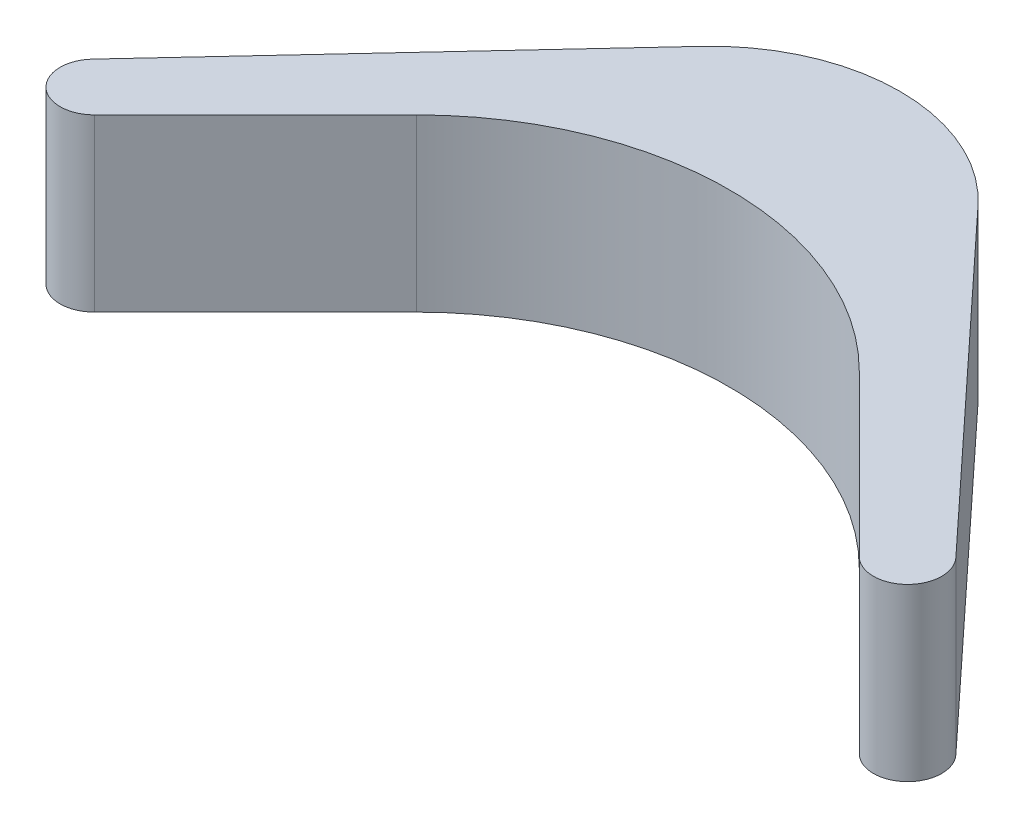
ISO-10303-21;
HEADER;
FILE_DESCRIPTION(('STEP AP214'),'2;1');
FILE_NAME('part.step','',(''),(''),'','','');
FILE_SCHEMA(('AUTOMOTIVE_DESIGN { 1 0 10303 214 1 1 1 1 }'));
ENDSEC;
DATA;
#1=APPLICATION_CONTEXT('core data for automotive mechanical design processes');
#2=APPLICATION_PROTOCOL_DEFINITION('international standard','automotive_design',2000,#1);
#3=PRODUCT_CONTEXT('',#1,'mechanical');
#4=PRODUCT('Part','Part','',(#3));
#5=PRODUCT_RELATED_PRODUCT_CATEGORY('part','',(#4));
#6=PRODUCT_DEFINITION_FORMATION('','',#4);
#7=PRODUCT_DEFINITION_CONTEXT('part definition',#1,'design');
#8=PRODUCT_DEFINITION('design','',#6,#7);
#9=PRODUCT_DEFINITION_SHAPE('','',#8);
#10=(LENGTH_UNIT() NAMED_UNIT(*) SI_UNIT(.MILLI.,.METRE.));
#11=(NAMED_UNIT(*) PLANE_ANGLE_UNIT() SI_UNIT($,.RADIAN.));
#12=(NAMED_UNIT(*) SI_UNIT($,.STERADIAN.) SOLID_ANGLE_UNIT());
#13=UNCERTAINTY_MEASURE_WITH_UNIT(LENGTH_MEASURE(1.E-05),#10,'distance_accuracy_value','');
#14=(GEOMETRIC_REPRESENTATION_CONTEXT(3) GLOBAL_UNCERTAINTY_ASSIGNED_CONTEXT((#13)) GLOBAL_UNIT_ASSIGNED_CONTEXT((#10,
#11,#12)) REPRESENTATION_CONTEXT('',''));
#15=CARTESIAN_POINT('',(0.,0.,0.));
#16=DIRECTION('',(0.,0.,1.));
#17=DIRECTION('',(1.,0.,0.));
#18=AXIS2_PLACEMENT_3D('',#15,#16,#17);
#19=CARTESIAN_POINT('',(25.0496242970424,15.,-23.2931720856756));
#20=DIRECTION('',(0.732315080008866,0.,-0.68096594892227));
#21=DIRECTION('',(-0.68096594892227,0.,-0.732315080008866));
#22=AXIS2_PLACEMENT_3D('',#19,#20,#21);
#23=PLANE('',#22);
#24=DIRECTION('',(0.68096594892227,0.,0.732315080008866));
#25=VECTOR('',#24,1.);
#26=CARTESIAN_POINT('',(25.0496242970424,0.,-23.2931720856756));
#27=LINE('',#26,#25);
#28=CARTESIAN_POINT('',(12.1319215547242,0.,-37.1849511566307));
#29=VERTEX_POINT('',#28);
#30=CARTESIAN_POINT('',(37.9058376899472,0.,-9.46751904922576));
#31=VERTEX_POINT('',#30);
#32=EDGE_CURVE('E129',#29,#31,#27,.T.);
#33=ORIENTED_EDGE('',*,*,#32,.F.);
#34=DIRECTION('',(0.,-1.,0.));
#35=VECTOR('',#34,1.);
#36=CARTESIAN_POINT('',(12.1319215547242,15.,-37.1849511566307));
#37=LINE('',#36,#35);
#38=CARTESIAN_POINT('',(12.1319215547242,15.,-37.1849511566307));
#39=VERTEX_POINT('',#38);
#40=EDGE_CURVE('E11',#39,#29,#37,.T.);
#41=ORIENTED_EDGE('',*,*,#40,.F.);
#42=DIRECTION('',(0.68096594892227,0.,0.732315080008866));
#43=VECTOR('',#42,1.);
#44=CARTESIAN_POINT('',(25.0496242970424,15.,-23.2931720856756));
#45=LINE('',#44,#43);
#46=CARTESIAN_POINT('',(37.9058376899472,15.,-9.46751904922576));
#47=VERTEX_POINT('',#46);
#48=EDGE_CURVE('E148',#39,#47,#45,.T.);
#49=ORIENTED_EDGE('',*,*,#48,.T.);
#50=DIRECTION('',(0.,-1.,0.));
#51=VECTOR('',#50,1.);
#52=CARTESIAN_POINT('',(37.9058376899472,15.,-9.46751904922576));
#53=LINE('',#52,#51);
#54=EDGE_CURVE('E85',#47,#31,#53,.T.);
#55=ORIENTED_EDGE('',*,*,#54,.T.);
#56=EDGE_LOOP('',(#33,#41,#49,#55));
#57=FACE_BOUND('',#56,.T.);
#58=ADVANCED_FACE('F35',(#57),#23,.T.);
#59=CARTESIAN_POINT('',(0.,15.,-25.9037066496034));
#60=DIRECTION('',(0.,-1.,0.));
#61=DIRECTION('',(0.,0.,-1.));
#62=AXIS2_PLACEMENT_3D('',#59,#60,#61);
#63=CYLINDRICAL_SURFACE('',#62,16.5665324747612);
#64=CARTESIAN_POINT('',(0.,0.,-25.9037066496034));
#65=DIRECTION('',(0.,1.,0.));
#66=DIRECTION('',(0.,0.,1.));
#67=AXIS2_PLACEMENT_3D('',#64,#65,#66);
#68=CIRCLE('',#67,16.5665324747612);
#69=CARTESIAN_POINT('',(-12.1319215547243,0.,-37.1849511566307));
#70=VERTEX_POINT('',#69);
#71=EDGE_CURVE('E132',#29,#70,#68,.T.);
#72=ORIENTED_EDGE('',*,*,#71,.T.);
#73=DIRECTION('',(0.,-1.,0.));
#74=VECTOR('',#73,1.);
#75=CARTESIAN_POINT('',(-12.1319215547243,15.,-37.1849511566307));
#76=LINE('',#75,#74);
#77=CARTESIAN_POINT('',(-12.1319215547243,15.,-37.1849511566307));
#78=VERTEX_POINT('',#77);
#79=EDGE_CURVE('E43',#78,#70,#76,.T.);
#80=ORIENTED_EDGE('',*,*,#79,.F.);
#81=CARTESIAN_POINT('',(0.,15.,-25.9037066496034));
#82=DIRECTION('',(0.,1.,0.));
#83=DIRECTION('',(0.,0.,1.));
#84=AXIS2_PLACEMENT_3D('',#81,#82,#83);
#85=CIRCLE('',#84,16.5665324747612);
#86=EDGE_CURVE('E173',#39,#78,#85,.T.);
#87=ORIENTED_EDGE('',*,*,#86,.F.);
#88=ORIENTED_EDGE('',*,*,#40,.T.);
#89=EDGE_LOOP('',(#72,#80,#87,#88));
#90=FACE_BOUND('',#89,.T.);
#91=ADVANCED_FACE('F164',(#90),#63,.T.);
#92=CARTESIAN_POINT('',(-25.0496242970424,15.,-23.2931720856756));
#93=DIRECTION('',(-0.732315080008867,0.,-0.680965948922269));
#94=DIRECTION('',(-0.680965948922269,0.,0.732315080008867));
#95=AXIS2_PLACEMENT_3D('',#92,#93,#94);
#96=PLANE('',#95);
#97=DIRECTION('',(0.680965948922269,0.,-0.732315080008867));
#98=VECTOR('',#97,1.);
#99=CARTESIAN_POINT('',(-25.0496242970424,0.,-23.2931720856756));
#100=LINE('',#99,#98);
#101=CARTESIAN_POINT('',(-37.9058376899465,0.,-9.46751904922648));
#102=VERTEX_POINT('',#101);
#103=EDGE_CURVE('E135',#102,#70,#100,.T.);
#104=ORIENTED_EDGE('',*,*,#103,.F.);
#105=DIRECTION('',(0.,-1.,0.));
#106=VECTOR('',#105,1.);
#107=CARTESIAN_POINT('',(-37.9058376899465,15.,-9.46751904922648));
#108=LINE('',#107,#106);
#109=CARTESIAN_POINT('',(-37.9058376899465,15.,-9.46751904922648));
#110=VERTEX_POINT('',#109);
#111=EDGE_CURVE('E154',#110,#102,#108,.T.);
#112=ORIENTED_EDGE('',*,*,#111,.F.);
#113=DIRECTION('',(0.680965948922269,0.,-0.732315080008867));
#114=VECTOR('',#113,1.);
#115=CARTESIAN_POINT('',(-25.0496242970424,15.,-23.2931720856756));
#116=LINE('',#115,#114);
#117=EDGE_CURVE('E161',#110,#78,#116,.T.);
#118=ORIENTED_EDGE('',*,*,#117,.T.);
#119=ORIENTED_EDGE('',*,*,#79,.T.);
#120=EDGE_LOOP('',(#104,#112,#118,#119));
#121=FACE_BOUND('',#120,.T.);
#122=ADVANCED_FACE('F159',(#121),#96,.T.);
#123=CARTESIAN_POINT('',(-35.7088924499199,15.,-7.42462120245968));
#124=DIRECTION('',(0.,-1.,0.));
#125=DIRECTION('',(0.,0.,-1.));
#126=AXIS2_PLACEMENT_3D('',#123,#124,#125);
#127=CYLINDRICAL_SURFACE('',#126,3.);
#128=CARTESIAN_POINT('',(-35.7088924499199,0.,-7.42462120245968));
#129=DIRECTION('',(0.,1.,0.));
#130=DIRECTION('',(0.,0.,1.));
#131=AXIS2_PLACEMENT_3D('',#128,#129,#130);
#132=CIRCLE('',#131,3.);
#133=CARTESIAN_POINT('',(-33.5875721063602,0.,-5.30330085890003));
#134=VERTEX_POINT('',#133);
#135=EDGE_CURVE('E138',#102,#134,#132,.T.);
#136=ORIENTED_EDGE('',*,*,#135,.T.);
#137=DIRECTION('',(0.,-1.,0.));
#138=VECTOR('',#137,1.);
#139=CARTESIAN_POINT('',(-33.5875721063602,15.,-5.30330085890003));
#140=LINE('',#139,#138);
#141=CARTESIAN_POINT('',(-33.5875721063602,15.,-5.30330085890003));
#142=VERTEX_POINT('',#141);
#143=EDGE_CURVE('E152',#142,#134,#140,.T.);
#144=ORIENTED_EDGE('',*,*,#143,.F.);
#145=CARTESIAN_POINT('',(-35.7088924499199,15.,-7.42462120245968));
#146=DIRECTION('',(0.,1.,0.));
#147=DIRECTION('',(0.,0.,1.));
#148=AXIS2_PLACEMENT_3D('',#145,#146,#147);
#149=CIRCLE('',#148,3.);
#150=EDGE_CURVE('E124',#110,#142,#149,.T.);
#151=ORIENTED_EDGE('',*,*,#150,.F.);
#152=ORIENTED_EDGE('',*,*,#111,.T.);
#153=EDGE_LOOP('',(#136,#144,#151,#152));
#154=FACE_BOUND('',#153,.T.);
#155=ADVANCED_FACE('F171',(#154),#127,.T.);
#156=CARTESIAN_POINT('',(-19.4454364826299,15.,-19.4454364826302));
#157=DIRECTION('',(0.707106781186544,0.,0.707106781186552));
#158=DIRECTION('',(0.707106781186552,0.,-0.707106781186544));
#159=AXIS2_PLACEMENT_3D('',#156,#157,#158);
#160=PLANE('',#159);
#161=DIRECTION('',(-0.707106781186552,0.,0.707106781186544));
#162=VECTOR('',#161,1.);
#163=CARTESIAN_POINT('',(-19.4454364826299,0.,-19.4454364826302));
#164=LINE('',#163,#162);
#165=CARTESIAN_POINT('',(-19.4454364826292,0.,-19.4454364826309));
#166=VERTEX_POINT('',#165);
#167=EDGE_CURVE('E141',#166,#134,#164,.T.);
#168=ORIENTED_EDGE('',*,*,#167,.F.);
#169=DIRECTION('',(0.,-1.,0.));
#170=VECTOR('',#169,1.);
#171=CARTESIAN_POINT('',(-19.4454364826292,15.,-19.4454364826309));
#172=LINE('',#171,#170);
#173=CARTESIAN_POINT('',(-19.4454364826292,15.,-19.4454364826309));
#174=VERTEX_POINT('',#173);
#175=EDGE_CURVE('E113',#174,#166,#172,.T.);
#176=ORIENTED_EDGE('',*,*,#175,.F.);
#177=DIRECTION('',(-0.707106781186552,0.,0.707106781186544));
#178=VECTOR('',#177,1.);
#179=CARTESIAN_POINT('',(-19.4454364826299,15.,-19.4454364826302));
#180=LINE('',#179,#178);
#181=EDGE_CURVE('E122',#174,#142,#180,.T.);
#182=ORIENTED_EDGE('',*,*,#181,.T.);
#183=ORIENTED_EDGE('',*,*,#143,.T.);
#184=EDGE_LOOP('',(#168,#176,#182,#183));
#185=FACE_BOUND('',#184,.T.);
#186=ADVANCED_FACE('F188',(#185),#160,.T.);
#187=CARTESIAN_POINT('',(0.,15.,0.));
#188=DIRECTION('',(0.,-1.,0.));
#189=DIRECTION('',(0.,0.,-1.));
#190=AXIS2_PLACEMENT_3D('',#187,#188,#189);
#191=CYLINDRICAL_SURFACE('',#190,27.5);
#192=CARTESIAN_POINT('',(0.,0.,0.));
#193=DIRECTION('',(0.,1.,0.));
#194=DIRECTION('',(0.,0.,1.));
#195=AXIS2_PLACEMENT_3D('',#192,#193,#194);
#196=CIRCLE('',#195,27.5);
#197=CARTESIAN_POINT('',(19.44543648263,0.,-19.4454364826302));
#198=VERTEX_POINT('',#197);
#199=EDGE_CURVE('E112',#198,#166,#196,.T.);
#200=ORIENTED_EDGE('',*,*,#199,.F.);
#201=DIRECTION('',(0.,-1.,0.));
#202=VECTOR('',#201,1.);
#203=CARTESIAN_POINT('',(19.44543648263,15.,-19.4454364826302));
#204=LINE('',#203,#202);
#205=CARTESIAN_POINT('',(19.44543648263,15.,-19.4454364826302));
#206=VERTEX_POINT('',#205);
#207=EDGE_CURVE('E106',#206,#198,#204,.T.);
#208=ORIENTED_EDGE('',*,*,#207,.F.);
#209=CARTESIAN_POINT('',(0.,15.,0.));
#210=DIRECTION('',(0.,1.,0.));
#211=DIRECTION('',(0.,0.,1.));
#212=AXIS2_PLACEMENT_3D('',#209,#210,#211);
#213=CIRCLE('',#212,27.5);
#214=EDGE_CURVE('E110',#206,#174,#213,.T.);
#215=ORIENTED_EDGE('',*,*,#214,.T.);
#216=ORIENTED_EDGE('',*,*,#175,.T.);
#217=EDGE_LOOP('',(#200,#208,#215,#216));
#218=FACE_BOUND('',#217,.T.);
#219=ADVANCED_FACE('F108',(#218),#191,.F.);
#220=CARTESIAN_POINT('',(19.44543648263,15.,-19.4454364826302));
#221=DIRECTION('',(0.707106781186544,0.,-0.707106781186551));
#222=DIRECTION('',(-0.707106781186551,0.,-0.707106781186544));
#223=AXIS2_PLACEMENT_3D('',#220,#221,#222);
#224=PLANE('',#223);
#225=DIRECTION('',(0.707106781186551,0.,0.707106781186544));
#226=VECTOR('',#225,1.);
#227=CARTESIAN_POINT('',(19.44543648263,0.,-19.4454364826302));
#228=LINE('',#227,#226);
#229=CARTESIAN_POINT('',(33.587572106361,0.,-5.30330085889928));
#230=VERTEX_POINT('',#229);
#231=EDGE_CURVE('E78',#198,#230,#228,.T.);
#232=ORIENTED_EDGE('',*,*,#231,.T.);
#233=DIRECTION('',(0.,-1.,0.));
#234=VECTOR('',#233,1.);
#235=CARTESIAN_POINT('',(33.587572106361,15.,-5.30330085889928));
#236=LINE('',#235,#234);
#237=CARTESIAN_POINT('',(33.587572106361,15.,-5.30330085889928));
#238=VERTEX_POINT('',#237);
#239=EDGE_CURVE('E114',#238,#230,#236,.T.);
#240=ORIENTED_EDGE('',*,*,#239,.F.);
#241=DIRECTION('',(0.707106781186551,0.,0.707106781186544));
#242=VECTOR('',#241,1.);
#243=CARTESIAN_POINT('',(19.44543648263,15.,-19.4454364826302));
#244=LINE('',#243,#242);
#245=EDGE_CURVE('E116',#206,#238,#244,.T.);
#246=ORIENTED_EDGE('',*,*,#245,.F.);
#247=ORIENTED_EDGE('',*,*,#207,.T.);
#248=EDGE_LOOP('',(#232,#240,#246,#247));
#249=FACE_BOUND('',#248,.T.);
#250=ADVANCED_FACE('F117',(#249),#224,.F.);
#251=CARTESIAN_POINT('',(35.7088924499206,15.,-7.42462120245894));
#252=DIRECTION('',(0.,-1.,0.));
#253=DIRECTION('',(0.,0.,-1.));
#254=AXIS2_PLACEMENT_3D('',#251,#252,#253);
#255=CYLINDRICAL_SURFACE('',#254,3.00000000000001);
#256=CARTESIAN_POINT('',(35.7088924499206,0.,-7.42462120245894));
#257=DIRECTION('',(0.,1.,0.));
#258=DIRECTION('',(0.,0.,1.));
#259=AXIS2_PLACEMENT_3D('',#256,#257,#258);
#260=CIRCLE('',#259,3.00000000000001);
#261=EDGE_CURVE('E146',#230,#31,#260,.T.);
#262=ORIENTED_EDGE('',*,*,#261,.T.);
#263=ORIENTED_EDGE('',*,*,#54,.F.);
#264=CARTESIAN_POINT('',(35.7088924499206,15.,-7.42462120245894));
#265=DIRECTION('',(0.,1.,0.));
#266=DIRECTION('',(0.,0.,1.));
#267=AXIS2_PLACEMENT_3D('',#264,#265,#266);
#268=CIRCLE('',#267,3.00000000000001);
#269=EDGE_CURVE('E51',#238,#47,#268,.T.);
#270=ORIENTED_EDGE('',*,*,#269,.F.);
#271=ORIENTED_EDGE('',*,*,#239,.T.);
#272=EDGE_LOOP('',(#262,#263,#270,#271));
#273=FACE_BOUND('',#272,.T.);
#274=ADVANCED_FACE('F196',(#273),#255,.T.);
#275=CARTESIAN_POINT('',(0.,15.,0.));
#276=DIRECTION('',(0.,1.,0.));
#277=DIRECTION('',(0.,0.,1.));
#278=AXIS2_PLACEMENT_3D('',#275,#276,#277);
#279=PLANE('',#278);
#280=ORIENTED_EDGE('',*,*,#48,.F.);
#281=ORIENTED_EDGE('',*,*,#86,.T.);
#282=ORIENTED_EDGE('',*,*,#117,.F.);
#283=ORIENTED_EDGE('',*,*,#150,.T.);
#284=ORIENTED_EDGE('',*,*,#181,.F.);
#285=ORIENTED_EDGE('',*,*,#214,.F.);
#286=ORIENTED_EDGE('',*,*,#245,.T.);
#287=ORIENTED_EDGE('',*,*,#269,.T.);
#288=EDGE_LOOP('',(#280,#281,#282,#283,#284,#285,#286,#287));
#289=FACE_BOUND('',#288,.T.);
#290=ADVANCED_FACE('F120',(#289),#279,.T.);
#291=CARTESIAN_POINT('',(0.,0.,0.));
#292=DIRECTION('',(0.,1.,0.));
#293=DIRECTION('',(0.,0.,1.));
#294=AXIS2_PLACEMENT_3D('',#291,#292,#293);
#295=PLANE('',#294);
#296=ORIENTED_EDGE('',*,*,#32,.T.);
#297=ORIENTED_EDGE('',*,*,#261,.F.);
#298=ORIENTED_EDGE('',*,*,#231,.F.);
#299=ORIENTED_EDGE('',*,*,#199,.T.);
#300=ORIENTED_EDGE('',*,*,#167,.T.);
#301=ORIENTED_EDGE('',*,*,#135,.F.);
#302=ORIENTED_EDGE('',*,*,#103,.T.);
#303=ORIENTED_EDGE('',*,*,#71,.F.);
#304=EDGE_LOOP('',(#296,#297,#298,#299,#300,#301,#302,#303));
#305=FACE_BOUND('',#304,.T.);
#306=ADVANCED_FACE('F167',(#305),#295,.F.);
#307=CLOSED_SHELL('',(#58,#91,#122,#155,#186,#219,#250,#274,#290,#306));
#308=MANIFOLD_SOLID_BREP('B2',#307);
#309=ADVANCED_BREP_SHAPE_REPRESENTATION('',(#18,#308),#14);
#310=SHAPE_DEFINITION_REPRESENTATION(#9,#309);
ENDSEC;
END-ISO-10303-21;
